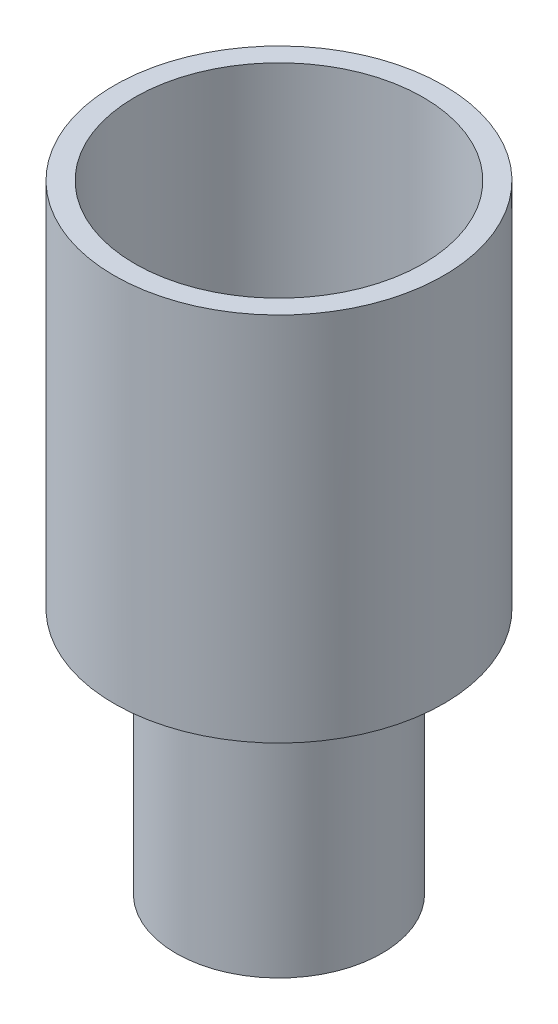
ISO-10303-21;
HEADER;
FILE_DESCRIPTION(('STEP AP214'),'2;1');
FILE_NAME('part.step','',(''),(''),'','','');
FILE_SCHEMA(('AUTOMOTIVE_DESIGN { 1 0 10303 214 1 1 1 1 }'));
ENDSEC;
DATA;
#1=APPLICATION_CONTEXT('core data for automotive mechanical design processes');
#2=APPLICATION_PROTOCOL_DEFINITION('international standard','automotive_design',2000,#1);
#3=PRODUCT_CONTEXT('',#1,'mechanical');
#4=PRODUCT('Part','Part','',(#3));
#5=PRODUCT_RELATED_PRODUCT_CATEGORY('part','',(#4));
#6=PRODUCT_DEFINITION_FORMATION('','',#4);
#7=PRODUCT_DEFINITION_CONTEXT('part definition',#1,'design');
#8=PRODUCT_DEFINITION('design','',#6,#7);
#9=PRODUCT_DEFINITION_SHAPE('','',#8);
#10=(LENGTH_UNIT() NAMED_UNIT(*) SI_UNIT(.MILLI.,.METRE.));
#11=(NAMED_UNIT(*) PLANE_ANGLE_UNIT() SI_UNIT($,.RADIAN.));
#12=(NAMED_UNIT(*) SI_UNIT($,.STERADIAN.) SOLID_ANGLE_UNIT());
#13=UNCERTAINTY_MEASURE_WITH_UNIT(LENGTH_MEASURE(1.E-05),#10,'distance_accuracy_value','');
#14=(GEOMETRIC_REPRESENTATION_CONTEXT(3) GLOBAL_UNCERTAINTY_ASSIGNED_CONTEXT((#13)) GLOBAL_UNIT_ASSIGNED_CONTEXT((#10,
#11,#12)) REPRESENTATION_CONTEXT('',''));
#15=CARTESIAN_POINT('',(0.,0.,0.));
#16=DIRECTION('',(0.,0.,1.));
#17=DIRECTION('',(1.,0.,0.));
#18=AXIS2_PLACEMENT_3D('',#15,#16,#17);
#19=CARTESIAN_POINT('',(0.,5.,0.));
#20=DIRECTION('',(0.,-1.,0.));
#21=DIRECTION('',(0.,0.,-1.));
#22=AXIS2_PLACEMENT_3D('',#19,#20,#21);
#23=CYLINDRICAL_SURFACE('',#22,2.5);
#24=CARTESIAN_POINT('',(0.,5.,0.));
#25=DIRECTION('',(0.,-1.,0.));
#26=DIRECTION('',(0.,0.,-1.));
#27=AXIS2_PLACEMENT_3D('',#24,#25,#26);
#28=CIRCLE('',#27,2.5);
#29=CARTESIAN_POINT('',(0.,5.,-2.5));
#30=VERTEX_POINT('',#29);
#31=EDGE_CURVE('E11',#30,#30,#28,.F.);
#32=ORIENTED_EDGE('',*,*,#31,.F.);
#33=EDGE_LOOP('',(#32));
#34=FACE_BOUND('',#33,.T.);
#35=CARTESIAN_POINT('',(0.,0.,0.));
#36=DIRECTION('',(0.,1.,0.));
#37=DIRECTION('',(0.,0.,1.));
#38=AXIS2_PLACEMENT_3D('',#35,#36,#37);
#39=CIRCLE('',#38,2.5);
#40=CARTESIAN_POINT('',(0.,0.,2.5));
#41=VERTEX_POINT('',#40);
#42=EDGE_CURVE('E52',#41,#41,#39,.T.);
#43=ORIENTED_EDGE('',*,*,#42,.T.);
#44=EDGE_LOOP('',(#43));
#45=FACE_BOUND('',#44,.T.);
#46=ADVANCED_FACE('F45',(#34,#45),#23,.T.);
#47=CARTESIAN_POINT('',(0.,0.,0.));
#48=DIRECTION('',(0.,1.,0.));
#49=DIRECTION('',(0.,0.,1.));
#50=AXIS2_PLACEMENT_3D('',#47,#48,#49);
#51=PLANE('',#50);
#52=CARTESIAN_POINT('',(0.,0.,0.));
#53=DIRECTION('',(0.,1.,0.));
#54=DIRECTION('',(0.,0.,1.));
#55=AXIS2_PLACEMENT_3D('',#52,#53,#54);
#56=CIRCLE('',#55,2.);
#57=CARTESIAN_POINT('',(0.,0.,2.));
#58=VERTEX_POINT('',#57);
#59=EDGE_CURVE('E57',#58,#58,#56,.T.);
#60=ORIENTED_EDGE('',*,*,#59,.T.);
#61=EDGE_LOOP('',(#60));
#62=FACE_BOUND('',#61,.T.);
#63=ORIENTED_EDGE('',*,*,#42,.F.);
#64=EDGE_LOOP('',(#63));
#65=FACE_BOUND('',#64,.T.);
#66=ADVANCED_FACE('F129',(#62,#65),#51,.F.);
#67=CARTESIAN_POINT('',(0.,-5.,0.));
#68=DIRECTION('',(0.,1.,0.));
#69=DIRECTION('',(0.,0.,1.));
#70=AXIS2_PLACEMENT_3D('',#67,#68,#69);
#71=CYLINDRICAL_SURFACE('',#70,2.);
#72=ORIENTED_EDGE('',*,*,#59,.F.);
#73=EDGE_LOOP('',(#72));
#74=FACE_BOUND('',#73,.T.);
#75=CARTESIAN_POINT('',(0.,6.,0.));
#76=DIRECTION('',(0.,-1.,0.));
#77=DIRECTION('',(0.,0.,-1.));
#78=AXIS2_PLACEMENT_3D('',#75,#76,#77);
#79=CIRCLE('',#78,2.);
#80=CARTESIAN_POINT('',(0.,6.,-2.));
#81=VERTEX_POINT('',#80);
#82=EDGE_CURVE('E48',#81,#81,#79,.T.);
#83=ORIENTED_EDGE('',*,*,#82,.F.);
#84=EDGE_LOOP('',(#83));
#85=FACE_BOUND('',#84,.T.);
#86=ADVANCED_FACE('F90',(#74,#85),#71,.F.);
#87=CARTESIAN_POINT('',(0.174217076163708,5.,2.49392229437346));
#88=CARTESIAN_POINT('',(2.21705391494678,6.,3.32936509536265));
#89=CARTESIAN_POINT('',(5.16206166491062,5.,2.14548814204604));
#90=CARTESIAN_POINT('',(8.87578410567208,6.,-1.10474273453091));
#91=CARTESIAN_POINT('',(4.81362751258321,5.,-2.84235644670087));
#92=CARTESIAN_POINT('',(4.44167627577852,6.,-7.76347292525621));
#93=CARTESIAN_POINT('',(-0.174217076163708,5.,-2.49392229437346));
#94=CARTESIAN_POINT('',(-2.21705391494678,6.,-3.32936509536265));
#95=CARTESIAN_POINT('',(-5.16206166491062,5.,-2.14548814204604));
#96=CARTESIAN_POINT('',(-8.87578410567208,6.,1.1047427345309));
#97=CARTESIAN_POINT('',(-4.81362751258321,5.,2.84235644670088));
#98=CARTESIAN_POINT('',(-4.44167627577852,6.,7.7634729252562));
#99=CARTESIAN_POINT('',(0.174217076163708,5.,2.49392229437346));
#100=CARTESIAN_POINT('',(2.21705391494678,6.,3.32936509536265));
#101=(BOUNDED_SURFACE() B_SPLINE_SURFACE(3,1,((#87,#88),(#89,#90),(#91,#92),(#93,#94),(#95,#96),
(#97,#98),(#99,#100)),.UNSPECIFIED.,.T.,.F.,.F.) B_SPLINE_SURFACE_WITH_KNOTS((4,3,4),(2,2),(0.,
0.5,1.),(0.,1.),.UNSPECIFIED.) GEOMETRIC_REPRESENTATION_ITEM() RATIONAL_B_SPLINE_SURFACE(((1.,
1.),(0.333333333333333,0.333333333333333),(0.333333333333333,0.333333333333333),(1.,1.),
(0.333333333333333,0.333333333333334),(0.333333333333333,0.333333333333334),(1.,1.))) REPRESENTATION_ITEM('') SURFACE());
#102=CARTESIAN_POINT('',(-1.36727064176107E-12,6.0000000000011,-4.00000000000202));
#103=CARTESIAN_POINT('',(0.0656009754900479,6.0000000000011,-4.00000143440903));
#104=CARTESIAN_POINT('',(0.131202001130645,6.0000000000011,-3.99838626246379));
#105=CARTESIAN_POINT('',(0.263911971328443,6.0000000000011,-3.99185075355102));
#106=CARTESIAN_POINT('',(0.331016837137034,6.0000000000011,-3.98684740733562));
#107=CARTESIAN_POINT('',(0.466524932259604,6.0000000000011,-3.97329893992633));
#108=CARTESIAN_POINT('',(0.534919815567753,6.0000000000011,-3.96467025403791));
#109=CARTESIAN_POINT('',(0.672763982099416,6.0000000000011,-3.94364830448712));
#110=CARTESIAN_POINT('',(0.742200582547428,6.0000000000011,-3.93117182272015));
#111=CARTESIAN_POINT('',(0.881849459970136,6.0000000000011,-3.90224785895984));
#112=CARTESIAN_POINT('',(0.952044770703426,6.0000000000011,-3.8857184213441));
#113=CARTESIAN_POINT('',(1.092898327466,6.0000000000011,-3.84850487502272));
#114=CARTESIAN_POINT('',(1.16353552586295,6.0000000000011,-3.82774106853273));
#115=CARTESIAN_POINT('',(1.30492759368419,6.0000000000011,-3.78190359496053));
#116=CARTESIAN_POINT('',(1.3756576966837,6.0000000000011,-3.75675351464487));
#117=CARTESIAN_POINT('',(1.51686115676029,6.0000000000011,-3.70202229163667));
#118=CARTESIAN_POINT('',(1.58730657833087,6.0000000000011,-3.67236904071614));
#119=CARTESIAN_POINT('',(1.72753869197221,6.0000000000011,-3.60855139986938));
#120=CARTESIAN_POINT('',(1.79729496752684,6.0000000000011,-3.5743202143824));
#121=CARTESIAN_POINT('',(1.93573324851001,6.0000000000011,-3.50130708398049));
#122=CARTESIAN_POINT('',(2.00438336208988,6.0000000000011,-3.46246448782055));
#123=CARTESIAN_POINT('',(2.10588262949004,6.0000000000011,-3.40100647404193));
#124=CARTESIAN_POINT('',(2.1396374222768,6.0000000000011,-3.37987244537724));
#125=CARTESIAN_POINT('',(2.2067104092738,6.0000000000011,-3.33647035297228));
#126=CARTESIAN_POINT('',(2.2400245717925,6.0000000000011,-3.31419604288097));
#127=CARTESIAN_POINT('',(2.30615934433747,6.0000000000011,-3.26852466029188));
#128=CARTESIAN_POINT('',(2.33897597484391,6.0000000000011,-3.24512182878703));
#129=CARTESIAN_POINT('',(2.4040607673726,6.0000000000011,-3.19720713736916));
#130=CARTESIAN_POINT('',(2.4363250540153,6.0000000000011,-3.17269001230381));
#131=CARTESIAN_POINT('',(2.50025006797776,6.0000000000011,-3.12256424026835));
#132=CARTESIAN_POINT('',(2.53190706215156,6.0000000000011,-3.09695083253483));
#133=CARTESIAN_POINT('',(2.59456316911076,6.0000000000011,-3.04465343677009));
#134=CARTESIAN_POINT('',(2.62555873334223,6.0000000000011,-3.01796519716434));
#135=CARTESIAN_POINT('',(2.68683852266178,6.0000000000011,-2.96354259109181));
#136=CARTESIAN_POINT('',(2.71711942535202,6.0000000000011,-2.93580448354372));
#137=CARTESIAN_POINT('',(2.77691762491078,6.0000000000011,-2.87931003907636));
#138=CARTESIAN_POINT('',(2.80643186700953,6.0000000000011,-2.85055046868548));
#139=CARTESIAN_POINT('',(2.86464593263685,6.0000000000011,-2.79204437819917));
#140=CARTESIAN_POINT('',(2.89334300966448,6.0000000000011,-2.76229512526933));
#141=CARTESIAN_POINT('',(2.94987366134269,6.0000000000011,-2.70184423486072));
#142=CARTESIAN_POINT('',(2.97770483717647,6.0000000000011,-2.67114035409845));
#143=CARTESIAN_POINT('',(3.03245659458764,6.0000000000011,-2.60881793850382));
#144=CARTESIAN_POINT('',(3.05937516274723,6.0000000000011,-2.57719763481575));
#145=CARTESIAN_POINT('',(3.11225685870659,6.0000000000011,-2.51308312327764));
#146=CARTESIAN_POINT('',(3.13821839405879,6.0000000000011,-2.4805876019646));
#147=CARTESIAN_POINT('',(3.18914366446465,6.0000000000011,-2.41476625476008));
#148=CARTESIAN_POINT('',(3.21410626104089,6.0000000000011,-2.38143954803558));
#149=CARTESIAN_POINT('',(3.262994004824,6.0000000000011,-2.31400208685533));
#150=CARTESIAN_POINT('',(3.28691849755374,6.0000000000011,-2.27989085794491));
#151=CARTESIAN_POINT('',(3.33369330188344,6.0000000000011,-2.2109330532376));
#152=CARTESIAN_POINT('',(3.35654346970404,6.0000000000011,-2.1760863799136));
#153=CARTESIAN_POINT('',(3.4011359957403,6.0000000000011,-2.10570859913371));
#154=CARTESIAN_POINT('',(3.42287874391906,6.0000000000011,-2.07017773876439));
#155=CARTESIAN_POINT('',(3.46522606901092,6.0000000000011,-1.99848445996687));
#156=CARTESIAN_POINT('',(3.48583158875003,6.0000000000011,-1.96232259843829));
#157=CARTESIAN_POINT('',(3.52587750153337,6.0000000000011,-1.88942189417207));
#158=CARTESIAN_POINT('',(3.54531940524508,6.0000000000011,-1.8526838812695));
#159=CARTESIAN_POINT('',(3.58301465074773,6.0000000000011,-1.7786868780863));
#160=CARTESIAN_POINT('',(3.60127008172412,6.0000000000011,-1.74142895205744));
#161=CARTESIAN_POINT('',(3.63657255426536,6.0000000000011,-1.66644927137695));
#162=CARTESIAN_POINT('',(3.65362226980814,6.0000000000011,-1.62872877568732));
#163=CARTESIAN_POINT('',(3.68649715224871,6.0000000000011,-1.55288196152527));
#164=CARTESIAN_POINT('',(3.70232557975062,6.0000000000011,-1.51475705629484));
#165=CARTESIAN_POINT('',(3.73274542823425,6.0000000000011,-1.43815999709401));
#166=CARTESIAN_POINT('',(3.747340693862,6.0000000000011,-1.39968936995189));
#167=CARTESIAN_POINT('',(3.77528546851964,6.0000000000011,-1.32245971568389));
#168=CARTESIAN_POINT('',(3.78863939931568,6.0000000000011,-1.28370228848953));
#169=CARTESIAN_POINT('',(3.81409643995404,6.0000000000011,-1.20595788663016));
#170=CARTESIAN_POINT('',(3.82620453756943,6.0000000000011,-1.16697254509729));
#171=CARTESIAN_POINT('',(3.84916849214699,6.0000000000011,-1.08883083520675));
#172=CARTESIAN_POINT('',(3.86002988774767,6.0000000000011,-1.04967609457952));
#173=CARTESIAN_POINT('',(3.88050257211134,6.0000000000011,-0.971253711265688));
#174=CARTESIAN_POINT('',(3.890119931568,6.0000000000011,-0.931987652763613));
#175=CARTESIAN_POINT('',(3.90811021065753,6.0000000000011,-0.853399336105698));
#176=CARTESIAN_POINT('',(3.91648971035952,6.0000000000011,-0.814078586262371));
#177=CARTESIAN_POINT('',(3.93201307994841,6.0000000000011,-0.735438759294172));
#178=CARTESIAN_POINT('',(3.93916401499333,6.0000000000011,-0.696121068301658));
#179=CARTESIAN_POINT('',(3.95871589098081,6.0000000000011,-0.578643929229074));
#180=CARTESIAN_POINT('',(3.96939189315774,6.0000000000011,-0.50018980387844));
#181=CARTESIAN_POINT('',(3.98595065572778,6.0000000000011,-0.343922859284506));
#182=CARTESIAN_POINT('',(3.99190007684962,6.0000000000011,-0.266117020117891));
#183=CARTESIAN_POINT('',(3.99918141456733,6.0000000000011,-0.11153117296645));
#184=CARTESIAN_POINT('',(4.0005854056832,6.0000000000011,-0.0347545768853575));
#185=CARTESIAN_POINT('',(3.99898765788649,6.0000000000011,0.117414013354459));
#186=CARTESIAN_POINT('',(3.99606226429354,6.0000000000011,0.192806821951724));
#187=CARTESIAN_POINT('',(3.98604912380406,6.0000000000011,0.341889172273821));
#188=CARTESIAN_POINT('',(3.97904079539286,6.0000000000011,0.415584053473362));
#189=CARTESIAN_POINT('',(3.96112940684747,6.0000000000011,0.560991279526934));
#190=CARTESIAN_POINT('',(3.95030767249542,6.0000000000011,0.632713650377753));
#191=CARTESIAN_POINT('',(3.92505482682694,6.0000000000011,0.773937659290823));
#192=CARTESIAN_POINT('',(3.91070583893747,6.0000000000011,0.843453990287012));
#193=CARTESIAN_POINT('',(3.8786951982433,6.0000000000011,0.980068434977841));
#194=CARTESIAN_POINT('',(3.86111544572916,6.0000000000011,1.04718574773122));
#195=CARTESIAN_POINT('',(3.82294551119973,6.0000000000011,1.17884432486595));
#196=CARTESIAN_POINT('',(3.80243609457786,6.0000000000011,1.24340901339922));
#197=CARTESIAN_POINT('',(3.75870935446792,6.0000000000011,1.36984226833448));
#198=CARTESIAN_POINT('',(3.73557087231651,6.0000000000011,1.43173811108932));
#199=CARTESIAN_POINT('',(3.68688426246551,6.0000000000011,1.55274887901178));
#200=CARTESIAN_POINT('',(3.66141239160759,6.0000000000011,1.6118944941424));
#201=CARTESIAN_POINT('',(3.60834917218522,6.0000000000011,1.72735237565971));
#202=CARTESIAN_POINT('',(3.58083096435886,6.00000000000111,1.78369826613098));
#203=CARTESIAN_POINT('',(3.52395402936124,6.00000000000111,1.89353344375242));
#204=CARTESIAN_POINT('',(3.4946649192017,6.0000000000011,1.94705879065126));
#205=CARTESIAN_POINT('',(3.43451149960372,6.0000000000011,2.05125547807341));
#206=CARTESIAN_POINT('',(3.40371299126969,6.0000000000011,2.10196481525173));
#207=CARTESIAN_POINT('',(3.34079066654617,6.0000000000011,2.20055458647921));
#208=CARTESIAN_POINT('',(3.30872864752494,6.0000000000011,2.24847447017407));
#209=CARTESIAN_POINT('',(3.24351254882722,6.0000000000011,2.34152967333799));
#210=CARTESIAN_POINT('',(3.21041616671217,6.0000000000011,2.38670543803266));
#211=CARTESIAN_POINT('',(3.14334723545589,6.0000000000011,2.47433285506001));
#212=CARTESIAN_POINT('',(3.10942826653459,6.0000000000011,2.51682552569758));
#213=CARTESIAN_POINT('',(3.04091242306153,6.0000000000011,2.5991603980909));
#214=CARTESIAN_POINT('',(3.00636505923824,6.0000000000011,2.63904380913906));
#215=CARTESIAN_POINT('',(2.93677313545699,6.0000000000011,2.71624431314611));
#216=CARTESIAN_POINT('',(2.90177411741347,6.0000000000011,2.75360246771399));
#217=CARTESIAN_POINT('',(2.83144241276376,6.0000000000011,2.82584469025143));
#218=CARTESIAN_POINT('',(2.79615144116582,6.0000000000011,2.86076937786247));
#219=CARTESIAN_POINT('',(2.72538277149423,6.0000000000011,2.9282428177219));
#220=CARTESIAN_POINT('',(2.68994313423801,6.0000000000011,2.96083149710848));
#221=CARTESIAN_POINT('',(2.61900825488167,6.0000000000011,3.0237350953184));
#222=CARTESIAN_POINT('',(2.58354761383709,6.0000000000011,3.05408904011851));
#223=CARTESIAN_POINT('',(2.5126869161811,6.0000000000011,3.11262772443188));
#224=CARTESIAN_POINT('',(2.47731820911187,6.0000000000011,3.14085041933333));
#225=CARTESIAN_POINT('',(2.40674359122443,6.0000000000011,3.19523214467838));
#226=CARTESIAN_POINT('',(2.37156599431832,6.0000000000011,3.22142792623851));
#227=CARTESIAN_POINT('',(2.30146286806146,6.0000000000011,3.27186115314793));
#228=CARTESIAN_POINT('',(2.2665628339881,6.0000000000011,3.29613404462985));
#229=CARTESIAN_POINT('',(2.1962866933888,6.0000000000011,3.34336700662876));
#230=CARTESIAN_POINT('',(2.16091655875907,6.0000000000011,3.36633596318061));
#231=CARTESIAN_POINT('',(2.08835542183455,6.0000000000011,3.41184147309539));
#232=CARTESIAN_POINT('',(2.0511420125162,6.0000000000011,3.43434230605359));
#233=CARTESIAN_POINT('',(1.97481103352454,6.0000000000011,3.47881210914086));
#234=CARTESIAN_POINT('',(1.93567048792475,6.0000000000011,3.50074164897236));
#235=CARTESIAN_POINT('',(1.85542579031111,6.0000000000011,3.54394365397896));
#236=CARTESIAN_POINT('',(1.8142986702235,6.0000000000011,3.56517346682573));
#237=CARTESIAN_POINT('',(1.73002686542774,6.0000000000011,3.60683870675422));
#238=CARTESIAN_POINT('',(1.68685941924268,6.0000000000011,3.62722810713776));
#239=CARTESIAN_POINT('',(1.59846002555323,6.0000000000011,3.66706269990451));
#240=CARTESIAN_POINT('',(1.55320575135433,6.0000000000011,3.68645835812834));
#241=CARTESIAN_POINT('',(1.46059453351595,6.0000000000011,3.72414284448265));
#242=CARTESIAN_POINT('',(1.4132159570603,6.0000000000011,3.74237852362617));
#243=CARTESIAN_POINT('',(1.31632866687928,6.0000000000011,3.77756752619032));
#244=CARTESIAN_POINT('',(1.26679930380896,6.0000000000011,3.79446401228465));
#245=CARTESIAN_POINT('',(1.16559579146201,6.0000000000011,3.82678632118646));
#246=CARTESIAN_POINT('',(1.11390229503866,6.0000000000011,3.84215158752884));
#247=CARTESIAN_POINT('',(1.00837097461533,6.0000000000011,3.8712107664529));
#248=CARTESIAN_POINT('',(0.954515450563424,6.0000000000011,3.88484042503518));
#249=CARTESIAN_POINT('',(0.844678075538326,6.0000000000011,3.91021604487809));
#250=CARTESIAN_POINT('',(0.788680537876825,6.0000000000011,3.92189413884261));
#251=CARTESIAN_POINT('',(0.674597220996415,6.0000000000011,3.94314374906572));
#252=CARTESIAN_POINT('',(0.616498149118075,6.0000000000011,3.95264394204619));
#253=CARTESIAN_POINT('',(0.498272533116603,6.0000000000011,3.96930589060073));
#254=CARTESIAN_POINT('',(0.438135475993058,6.0000000000011,3.97639310749066));
#255=CARTESIAN_POINT('',(0.315919930903521,6.0000000000011,3.98799031466373));
#256=CARTESIAN_POINT('',(0.253834088089879,6.0000000000011,3.9924228840134));
#257=CARTESIAN_POINT('',(0.127834777511987,6.0000000000011,3.99846766287517));
#258=CARTESIAN_POINT('',(0.0639174695443891,6.0000000000011,4.00000000265126));
#259=CARTESIAN_POINT('',(-0.0656009060451658,6.0000000000011,3.999999997283));
#260=CARTESIAN_POINT('',(-0.13120198229024,6.0000000000011,3.99838587257131));
#261=CARTESIAN_POINT('',(-0.263911990647982,6.0000000000011,3.99185115335888));
#262=CARTESIAN_POINT('',(-0.331016842375908,6.0000000000011,3.98684751575137));
#263=CARTESIAN_POINT('',(-0.466524926892708,6.0000000000011,3.97329882886115));
#264=CARTESIAN_POINT('',(-0.534919814113178,6.0000000000011,3.96467022393619));
#265=CARTESIAN_POINT('',(-0.672763983587968,6.0000000000011,3.94364833529189));
#266=CARTESIAN_POINT('',(-0.74220058295064,6.0000000000011,3.93117183106434));
#267=CARTESIAN_POINT('',(-0.881849459557986,6.0000000000011,3.90224785043053));
#268=CARTESIAN_POINT('',(-0.952044770591856,6.0000000000011,3.88571841903515));
#269=CARTESIAN_POINT('',(-1.09289832757991,6.0000000000011,3.84850487737998));
#270=CARTESIAN_POINT('',(-1.16353552589377,6.0000000000011,3.82774106917043));
#271=CARTESIAN_POINT('',(-1.30492759365277,6.0000000000011,3.78190359431034));
#272=CARTESIAN_POINT('',(-1.37565769667521,6.0000000000011,3.75675351446912));
#273=CARTESIAN_POINT('',(-1.51686115676894,6.0000000000011,3.70202229181561));
#274=CARTESIAN_POINT('',(-1.5873065783332,6.0000000000011,3.6723690407644));
#275=CARTESIAN_POINT('',(-1.72753869196984,6.0000000000011,3.60855139982031));
#276=CARTESIAN_POINT('',(-1.79729496752622,6.0000000000011,3.57432021436945));
#277=CARTESIAN_POINT('',(-1.93573324851065,6.0000000000011,3.50130708399363));
#278=CARTESIAN_POINT('',(-2.00438336209,6.0000000000011,3.46246448782297));
#279=CARTESIAN_POINT('',(-2.10588262948998,6.0000000000011,3.4010064740407));
#280=CARTESIAN_POINT('',(-2.13963742227678,6.0000000000011,3.37987244537691));
#281=CARTESIAN_POINT('',(-2.20671040927382,6.0000000000011,3.33647035297261));
#282=CARTESIAN_POINT('',(-2.2400245717925,6.0000000000011,3.31419604288105));
#283=CARTESIAN_POINT('',(-2.30615934433747,6.0000000000011,3.26852466029178));
#284=CARTESIAN_POINT('',(-2.33897597484391,6.0000000000011,3.24512182878701));
#285=CARTESIAN_POINT('',(-2.4040607673726,6.0000000000011,3.19720713736918));
#286=CARTESIAN_POINT('',(-2.4363250540153,6.0000000000011,3.17269001230381));
#287=CARTESIAN_POINT('',(-2.50025006797776,6.0000000000011,3.12256424026834));
#288=CARTESIAN_POINT('',(-2.53190706215156,6.0000000000011,3.09695083253483));
#289=CARTESIAN_POINT('',(-2.59456316911076,6.0000000000011,3.04465343677009));
#290=CARTESIAN_POINT('',(-2.62555873334223,6.0000000000011,3.01796519716433));
#291=CARTESIAN_POINT('',(-2.68683852266178,6.0000000000011,2.9635425910918));
#292=CARTESIAN_POINT('',(-2.71711942535202,6.0000000000011,2.93580448354372));
#293=CARTESIAN_POINT('',(-2.77691762491078,6.0000000000011,2.87931003907636));
#294=CARTESIAN_POINT('',(-2.80643186700953,6.0000000000011,2.85055046868548));
#295=CARTESIAN_POINT('',(-2.86464593263685,6.0000000000011,2.79204437819917));
#296=CARTESIAN_POINT('',(-2.89334300966448,6.0000000000011,2.76229512526933));
#297=CARTESIAN_POINT('',(-2.94987366134269,6.0000000000011,2.70184423486071));
#298=CARTESIAN_POINT('',(-2.97770483717647,6.0000000000011,2.67114035409845));
#299=CARTESIAN_POINT('',(-3.03245659458764,6.0000000000011,2.60881793850381));
#300=CARTESIAN_POINT('',(-3.05937516274723,6.0000000000011,2.57719763481574));
#301=CARTESIAN_POINT('',(-3.11225685870659,6.0000000000011,2.51308312327764));
#302=CARTESIAN_POINT('',(-3.1382183940588,6.0000000000011,2.4805876019646));
#303=CARTESIAN_POINT('',(-3.18914366446465,6.0000000000011,2.41476625476008));
#304=CARTESIAN_POINT('',(-3.21410626104089,6.0000000000011,2.38143954803557));
#305=CARTESIAN_POINT('',(-3.262994004824,6.0000000000011,2.31400208685533));
#306=CARTESIAN_POINT('',(-3.28691849755374,6.0000000000011,2.27989085794491));
#307=CARTESIAN_POINT('',(-3.33369330188344,6.0000000000011,2.2109330532376));
#308=CARTESIAN_POINT('',(-3.35654346970404,6.0000000000011,2.17608637991359));
#309=CARTESIAN_POINT('',(-3.4011359957403,6.0000000000011,2.1057085991337));
#310=CARTESIAN_POINT('',(-3.42287874391906,6.0000000000011,2.07017773876439));
#311=CARTESIAN_POINT('',(-3.46522606901092,6.0000000000011,1.99848445996687));
#312=CARTESIAN_POINT('',(-3.48583158875003,6.0000000000011,1.96232259843829));
#313=CARTESIAN_POINT('',(-3.52587750153338,6.0000000000011,1.88942189417207));
#314=CARTESIAN_POINT('',(-3.54531940524508,6.0000000000011,1.8526838812695));
#315=CARTESIAN_POINT('',(-3.58301465074773,6.0000000000011,1.77868687808629));
#316=CARTESIAN_POINT('',(-3.60127008172412,6.0000000000011,1.74142895205743));
#317=CARTESIAN_POINT('',(-3.63657255426536,6.0000000000011,1.66644927137695));
#318=CARTESIAN_POINT('',(-3.65362226980814,6.0000000000011,1.62872877568731));
#319=CARTESIAN_POINT('',(-3.68649715224871,6.0000000000011,1.55288196152527));
#320=CARTESIAN_POINT('',(-3.70232557975062,6.0000000000011,1.51475705629484));
#321=CARTESIAN_POINT('',(-3.73274542823425,6.0000000000011,1.43815999709401));
#322=CARTESIAN_POINT('',(-3.74734069386201,6.0000000000011,1.39968936995189));
#323=CARTESIAN_POINT('',(-3.77528546851964,6.0000000000011,1.32245971568389));
#324=CARTESIAN_POINT('',(-3.78863939931568,6.0000000000011,1.28370228848953));
#325=CARTESIAN_POINT('',(-3.81409643995404,6.0000000000011,1.20595788663016));
#326=CARTESIAN_POINT('',(-3.82620453756943,6.0000000000011,1.16697254509729));
#327=CARTESIAN_POINT('',(-3.84916849214699,6.0000000000011,1.08883083520675));
#328=CARTESIAN_POINT('',(-3.86002988774767,6.0000000000011,1.04967609457951));
#329=CARTESIAN_POINT('',(-3.88050257211134,6.0000000000011,0.971253711265686));
#330=CARTESIAN_POINT('',(-3.890119931568,6.0000000000011,0.931987652763611));
#331=CARTESIAN_POINT('',(-3.90811021065753,6.0000000000011,0.853399336105696));
#332=CARTESIAN_POINT('',(-3.91648971035952,6.0000000000011,0.814078586262369));
#333=CARTESIAN_POINT('',(-3.93201307994841,6.0000000000011,0.735438759294171));
#334=CARTESIAN_POINT('',(-3.93916401499333,6.0000000000011,0.696121068301657));
#335=CARTESIAN_POINT('',(-3.95871589098081,6.0000000000011,0.578643929229074));
#336=CARTESIAN_POINT('',(-3.96939189315774,6.0000000000011,0.500189803878443));
#337=CARTESIAN_POINT('',(-3.98595065572778,6.0000000000011,0.34392285928451));
#338=CARTESIAN_POINT('',(-3.99190007684962,6.0000000000011,0.266117020117892));
#339=CARTESIAN_POINT('',(-3.99918141456733,6.0000000000011,0.111531172966449));
#340=CARTESIAN_POINT('',(-4.0005854056832,6.00000000000111,0.0347545768853566));
#341=CARTESIAN_POINT('',(-3.99898765788649,6.0000000000011,-0.11741401335446));
#342=CARTESIAN_POINT('',(-3.99606226429354,6.0000000000011,-0.192806821951725));
#343=CARTESIAN_POINT('',(-3.98604912380406,6.0000000000011,-0.341889172273822));
#344=CARTESIAN_POINT('',(-3.97904079539286,6.0000000000011,-0.415584053473363));
#345=CARTESIAN_POINT('',(-3.96112940684747,6.0000000000011,-0.560991279526935));
#346=CARTESIAN_POINT('',(-3.95030767249543,6.0000000000011,-0.632713650377754));
#347=CARTESIAN_POINT('',(-3.92505482682694,6.0000000000011,-0.773937659290823));
#348=CARTESIAN_POINT('',(-3.91070583893747,6.0000000000011,-0.843453990287012));
#349=CARTESIAN_POINT('',(-3.8786951982433,6.0000000000011,-0.980068434977841));
#350=CARTESIAN_POINT('',(-3.86111544572916,6.0000000000011,-1.04718574773122));
#351=CARTESIAN_POINT('',(-3.82294551119973,6.0000000000011,-1.17884432486595));
#352=CARTESIAN_POINT('',(-3.80243609457786,6.0000000000011,-1.24340901339922));
#353=CARTESIAN_POINT('',(-3.75870935446792,6.0000000000011,-1.36984226833448));
#354=CARTESIAN_POINT('',(-3.73557087231651,6.0000000000011,-1.43173811108932));
#355=CARTESIAN_POINT('',(-3.68688426246551,6.0000000000011,-1.55274887901178));
#356=CARTESIAN_POINT('',(-3.66141239160759,6.0000000000011,-1.6118944941424));
#357=CARTESIAN_POINT('',(-3.60834917218522,6.0000000000011,-1.72735237565971));
#358=CARTESIAN_POINT('',(-3.58083096435885,6.0000000000011,-1.78369826613098));
#359=CARTESIAN_POINT('',(-3.52395402936124,6.0000000000011,-1.89353344375242));
#360=CARTESIAN_POINT('',(-3.4946649192017,6.0000000000011,-1.94705879065126));
#361=CARTESIAN_POINT('',(-3.43451149960373,6.0000000000011,-2.05125547807341));
#362=CARTESIAN_POINT('',(-3.40371299126969,6.0000000000011,-2.10196481525173));
#363=CARTESIAN_POINT('',(-3.34079066654617,6.0000000000011,-2.20055458647921));
#364=CARTESIAN_POINT('',(-3.30872864752494,6.0000000000011,-2.24847447017407));
#365=CARTESIAN_POINT('',(-3.24351254882722,6.0000000000011,-2.34152967333799));
#366=CARTESIAN_POINT('',(-3.21041616671217,6.0000000000011,-2.38670543803266));
#367=CARTESIAN_POINT('',(-3.14334723545589,6.0000000000011,-2.47433285506001));
#368=CARTESIAN_POINT('',(-3.1094282665346,6.0000000000011,-2.51682552569758));
#369=CARTESIAN_POINT('',(-3.04091242306153,6.0000000000011,-2.5991603980909));
#370=CARTESIAN_POINT('',(-3.00636505923824,6.0000000000011,-2.63904380913906));
#371=CARTESIAN_POINT('',(-2.93677313545699,6.0000000000011,-2.71624431314611));
#372=CARTESIAN_POINT('',(-2.90177411741347,6.0000000000011,-2.75360246771399));
#373=CARTESIAN_POINT('',(-2.83144241276376,6.0000000000011,-2.82584469025143));
#374=CARTESIAN_POINT('',(-2.79615144116582,6.0000000000011,-2.86076937786248));
#375=CARTESIAN_POINT('',(-2.72538277149423,6.0000000000011,-2.9282428177219));
#376=CARTESIAN_POINT('',(-2.68994313423801,6.0000000000011,-2.96083149710848));
#377=CARTESIAN_POINT('',(-2.61900825488167,6.0000000000011,-3.0237350953184));
#378=CARTESIAN_POINT('',(-2.58354761383709,6.0000000000011,-3.05408904011851));
#379=CARTESIAN_POINT('',(-2.5126869161811,6.0000000000011,-3.11262772443188));
#380=CARTESIAN_POINT('',(-2.47731820911187,6.0000000000011,-3.14085041933333));
#381=CARTESIAN_POINT('',(-2.40674359122443,6.0000000000011,-3.19523214467838));
#382=CARTESIAN_POINT('',(-2.37156599431832,6.0000000000011,-3.22142792623851));
#383=CARTESIAN_POINT('',(-2.30146286806146,6.0000000000011,-3.27186115314793));
#384=CARTESIAN_POINT('',(-2.2665628339881,6.0000000000011,-3.29613404462985));
#385=CARTESIAN_POINT('',(-2.1962866933888,6.0000000000011,-3.34336700662876));
#386=CARTESIAN_POINT('',(-2.16091655875906,6.0000000000011,-3.36633596318062));
#387=CARTESIAN_POINT('',(-2.08835542183455,6.0000000000011,-3.41184147309538));
#388=CARTESIAN_POINT('',(-2.05114201251619,6.0000000000011,-3.43434230605357));
#389=CARTESIAN_POINT('',(-1.97481103352454,6.0000000000011,-3.47881210914088));
#390=CARTESIAN_POINT('',(-1.93567048792475,6.0000000000011,-3.50074164897246));
#391=CARTESIAN_POINT('',(-1.8554257903111,6.0000000000011,-3.54394365397886));
#392=CARTESIAN_POINT('',(-1.81429867022348,6.0000000000011,-3.56517346682534));
#393=CARTESIAN_POINT('',(-1.73002686542776,6.0000000000011,-3.60683870675462));
#394=CARTESIAN_POINT('',(-1.68685941924276,6.0000000000011,-3.62722810713927));
#395=CARTESIAN_POINT('',(-1.59846002555315,6.0000000000011,-3.66706269990295));
#396=CARTESIAN_POINT('',(-1.55320575135405,6.0000000000011,-3.68645835812243));
#397=CARTESIAN_POINT('',(-1.46059453351625,6.0000000000011,-3.72414284448874));
#398=CARTESIAN_POINT('',(-1.41321595706143,6.0000000000011,-3.74237852364926));
#399=CARTESIAN_POINT('',(-1.31632866687812,6.0000000000011,-3.77756752616651));
#400=CARTESIAN_POINT('',(-1.26679930380456,6.0000000000011,-3.79446401219444));
#401=CARTESIAN_POINT('',(-1.16559579146655,6.0000000000011,-3.82678632127943));
#402=CARTESIAN_POINT('',(-1.11390229505586,6.0000000000011,-3.84215158788108));
#403=CARTESIAN_POINT('',(-1.00837097459761,6.0000000000011,-3.87121076609006));
#404=CARTESIAN_POINT('',(-0.954515450496305,6.0000000000011,-3.8848404236606));
#405=CARTESIAN_POINT('',(-0.844678075607437,6.0000000000011,-3.91021604629345));
#406=CARTESIAN_POINT('',(-0.788680538138586,6.0000000000011,-3.92189414420334));
#407=CARTESIAN_POINT('',(-0.674597220727025,6.0000000000011,-3.94314374354875));
#408=CARTESIAN_POINT('',(-0.616498148098009,6.0000000000011,-3.95264392115575));
#409=CARTESIAN_POINT('',(-0.498272534165803,6.0000000000011,-3.96930591208783));
#410=CARTESIAN_POINT('',(-0.438135479964793,6.0000000000011,-3.97639318882985));
#411=CARTESIAN_POINT('',(-0.315919926820976,6.0000000000011,-3.9879902310552));
#412=CARTESIAN_POINT('',(-0.253834072640454,6.0000000000011,-3.99242256761674));
#413=CARTESIAN_POINT('',(-0.127834793381014,6.0000000000011,-3.99846798786505));
#414=CARTESIAN_POINT('',(-0.0639175295751729,6.0000000000011,-4.00000123205228));
#415=CARTESIAN_POINT('',(-1.36583827629685E-12,6.0000000000011,-4.00000000000202));
#416=B_SPLINE_CURVE_WITH_KNOTS('',3,(#102,#103,#104,#105,#106,#107,#108,#109,#110,#111,#112,
#113,#114,#115,#116,#117,#118,#119,#120,#121,#122,#123,#124,#125,#126,#127,#128,#129,#130,#131,
#132,#133,#134,#135,#136,#137,#138,#139,#140,#141,#142,#143,#144,#145,#146,#147,#148,#149,#150,
#151,#152,#153,#154,#155,#156,#157,#158,#159,#160,#161,#162,#163,#164,#165,#166,#167,#168,#169,
#170,#171,#172,#173,#174,#175,#176,#177,#178,#179,#180,#181,#182,#183,#184,#185,#186,#187,#188,
#189,#190,#191,#192,#193,#194,#195,#196,#197,#198,#199,#200,#201,#202,#203,#204,#205,#206,#207,
#208,#209,#210,#211,#212,#213,#214,#215,#216,#217,#218,#219,#220,#221,#222,#223,#224,#225,#226,
#227,#228,#229,#230,#231,#232,#233,#234,#235,#236,#237,#238,#239,#240,#241,#242,#243,#244,#245,
#246,#247,#248,#249,#250,#251,#252,#253,#254,#255,#256,#257,#258,#259,#260,#261,#262,#263,#264,
#265,#266,#267,#268,#269,#270,#271,#272,#273,#274,#275,#276,#277,#278,#279,#280,#281,#282,#283,
#284,#285,#286,#287,#288,#289,#290,#291,#292,#293,#294,#295,#296,#297,#298,#299,#300,#301,#302,
#303,#304,#305,#306,#307,#308,#309,#310,#311,#312,#313,#314,#315,#316,#317,#318,#319,#320,#321,
#322,#323,#324,#325,#326,#327,#328,#329,#330,#331,#332,#333,#334,#335,#336,#337,#338,#339,#340,
#341,#342,#343,#344,#345,#346,#347,#348,#349,#350,#351,#352,#353,#354,#355,#356,#357,#358,#359,
#360,#361,#362,#363,#364,#365,#366,#367,#368,#369,#370,#371,#372,#373,#374,#375,#376,#377,#378,
#379,#380,#381,#382,#383,#384,#385,#386,#387,#388,#389,#390,#391,#392,#393,#394,#395,#396,#397,
#398,#399,#400,#401,#402,#403,#404,#405,#406,#407,#408,#409,#410,#411,#412,#413,#414,#415),
.UNSPECIFIED.,.F.,.F.,(4,2,2,2,2,2,2,2,2,2,2,2,2,2,2,2,2,2,2,2,2,2,2,2,2,2,2,2,2,2,2,2,2,2,2,2,
2,2,2,2,2,2,2,2,2,2,2,2,2,2,2,2,2,2,2,2,2,2,2,2,2,2,2,2,2,2,2,2,2,2,2,2,2,2,2,2,2,2,2,2,2,2,2,2,
2,2,2,2,2,2,2,2,2,2,2,2,2,2,2,2,2,2,2,2,2,2,2,2,2,2,2,2,2,2,2,2,2,2,2,2,2,2,2,2,2,2,2,2,2,2,2,2,
2,2,2,2,2,2,2,2,2,2,2,2,2,2,2,2,2,2,2,2,2,2,2,2,4),(0.,0.196783383053342,0.398571175656562,
0.605290189502603,0.816837307907665,1.033077573452,1.25384259155886,1.47892933746293,
1.70809945323987,1.94107911623431,2.17755954977296,2.29702010636767,2.41722511976406,
2.53812680676691,2.659675556886,2.78182003328407,2.90450728472167,3.02768286803299,
3.151290980544,3.27527460172461,3.3995756432524,3.52413510655949,3.64889324683738,
3.77378974239031,3.89876386815648,4.02375467216055,4.14870115362147,4.27354244141681,
4.39821797160026,4.52266766268161,4.64683208740907,4.7706526398406,4.89407169655435,
5.01703277092509,5.13948065948418,5.26136157948141,5.38262329687731,5.50321524411128,
5.62308862711219,5.86046782031991,6.09443659380243,6.32467679548747,6.55090496819514,
6.77287304630945,6.99036839331392,7.20321324728785,7.41126365336924,7.61440796887836,
7.81256502875128,8.00568205687497,8.19373240368609,8.37671318287029,8.55464287100714,
8.72755892428617,8.89551545658268,9.05858101370564,9.2168364698547,9.37037306447103,
9.51929059085505,9.66369574218781,9.80370061590579,9.93942137367153,10.0709770513568,
10.1984885114014,10.3249885632765,10.4554266302469,10.589996878102,10.7288189402916,
10.8720098762259,11.0196830210086,11.1719466870692,11.3289027114812,11.4906448453511,
11.6572569851207,11.8288112500385,12.0053659154957,12.1869632184455,12.3736270586963,
12.5653606284119,12.7621440114653,12.9639318040685,13.1706508179145,13.3821979363196,
13.5984382018639,13.8192032199708,14.0442899658749,14.2734600816518,14.5064397446463,
14.7429201781849,14.8623807347796,14.982585748176,15.1034874351789,15.2250361852979,
15.347180661696,15.4698679131336,15.5930434964449,15.7166516089559,15.8406352301366,
15.9649362716643,16.0894957349714,16.2142538752493,16.3391503708023,16.4641244965684,
16.5891153005725,16.7140617820334,16.8389030698288,16.9635786000122,17.0880282910936,
17.212192715821,17.3360132682525,17.4594323249663,17.582393399337,17.7048412878961,
17.8267222078934,17.9479839252893,18.0685758725232,18.1884492555241,18.4258284487318,
18.6597972222144,18.8900374238994,19.1162655966071,19.3382336747214,19.5557290217259,
19.7685738756998,19.9766242817812,20.1797685972903,20.3779256571632,20.5710426852869,
20.759093032098,20.9420738112822,21.1200034994191,21.2929195526981,21.4608760849946,
21.6239416421176,21.7821970982666,21.935733692883,22.084651219267,22.2290563705997,
22.3690612443177,22.5047820020835,22.6363376797687,22.7638491398133,22.8903491916885,
23.0207872586588,23.155357506514,23.2941795687035,23.4373705046379,23.5850436494205,
23.7373073154811,23.8942633398932,24.056005473763,24.2226176135326,24.3941718784504,
24.5707265439077,24.7523238468575,24.9389876871082,25.1307212568239),.UNSPECIFIED.);
#417=CARTESIAN_POINT('',(-1.36727064176107E-12,6.0000000000011,-4.00000000000202));
#418=VERTEX_POINT('',#417);
#419=EDGE_CURVE('E66',#418,#418,#416,.T.);
#420=ORIENTED_EDGE('',*,*,#31,.T.);
#421=EDGE_LOOP('',(#420));
#422=FACE_BOUND('',#421,.T.);
#423=ORIENTED_EDGE('',*,*,#419,.T.);
#424=EDGE_LOOP('',(#423));
#425=FACE_BOUND('',#424,.T.);
#426=ADVANCED_FACE('F81',(#422,#425),#101,.T.);
#427=CARTESIAN_POINT('',(0.,15.,0.));
#428=DIRECTION('',(0.,-1.,0.));
#429=DIRECTION('',(0.,0.,-1.));
#430=AXIS2_PLACEMENT_3D('',#427,#428,#429);
#431=CYLINDRICAL_SURFACE('',#430,4.);
#432=CARTESIAN_POINT('',(0.,15.,0.));
#433=DIRECTION('',(0.,1.,0.));
#434=DIRECTION('',(0.,0.,1.));
#435=AXIS2_PLACEMENT_3D('',#432,#433,#434);
#436=CIRCLE('',#435,4.);
#437=CARTESIAN_POINT('',(0.,15.,4.));
#438=VERTEX_POINT('',#437);
#439=EDGE_CURVE('E113',#438,#438,#436,.T.);
#440=ORIENTED_EDGE('',*,*,#439,.F.);
#441=EDGE_LOOP('',(#440));
#442=FACE_BOUND('',#441,.T.);
#443=ORIENTED_EDGE('',*,*,#419,.F.);
#444=EDGE_LOOP('',(#443));
#445=FACE_BOUND('',#444,.T.);
#446=ADVANCED_FACE('F70',(#442,#445),#431,.T.);
#447=CARTESIAN_POINT('',(0.,15.,0.));
#448=DIRECTION('',(0.,-1.,0.));
#449=DIRECTION('',(0.,0.,-1.));
#450=AXIS2_PLACEMENT_3D('',#447,#448,#449);
#451=CYLINDRICAL_SURFACE('',#450,3.5);
#452=CARTESIAN_POINT('',(0.,15.,0.));
#453=DIRECTION('',(0.,1.,0.));
#454=DIRECTION('',(0.,0.,1.));
#455=AXIS2_PLACEMENT_3D('',#452,#453,#454);
#456=CIRCLE('',#455,3.5);
#457=CARTESIAN_POINT('',(0.,15.,3.5));
#458=VERTEX_POINT('',#457);
#459=EDGE_CURVE('E112',#458,#458,#456,.T.);
#460=ORIENTED_EDGE('',*,*,#459,.T.);
#461=EDGE_LOOP('',(#460));
#462=FACE_BOUND('',#461,.T.);
#463=CARTESIAN_POINT('',(0.,6.,0.));
#464=DIRECTION('',(0.,-1.,0.));
#465=DIRECTION('',(0.,0.,-1.));
#466=AXIS2_PLACEMENT_3D('',#463,#464,#465);
#467=CIRCLE('',#466,3.5);
#468=CARTESIAN_POINT('',(0.,6.,-3.5));
#469=VERTEX_POINT('',#468);
#470=EDGE_CURVE('E109',#469,#469,#467,.T.);
#471=ORIENTED_EDGE('',*,*,#470,.T.);
#472=EDGE_LOOP('',(#471));
#473=FACE_BOUND('',#472,.T.);
#474=ADVANCED_FACE('F80',(#462,#473),#451,.F.);
#475=CARTESIAN_POINT('',(0.,15.,0.));
#476=DIRECTION('',(0.,1.,0.));
#477=DIRECTION('',(0.,0.,1.));
#478=AXIS2_PLACEMENT_3D('',#475,#476,#477);
#479=PLANE('',#478);
#480=ORIENTED_EDGE('',*,*,#439,.T.);
#481=EDGE_LOOP('',(#480));
#482=FACE_BOUND('',#481,.T.);
#483=ORIENTED_EDGE('',*,*,#459,.F.);
#484=EDGE_LOOP('',(#483));
#485=FACE_BOUND('',#484,.T.);
#486=ADVANCED_FACE('F83',(#482,#485),#479,.T.);
#487=CARTESIAN_POINT('',(0.,6.,0.));
#488=DIRECTION('',(0.,-1.,0.));
#489=DIRECTION('',(0.,0.,-1.));
#490=AXIS2_PLACEMENT_3D('',#487,#488,#489);
#491=PLANE('',#490);
#492=ORIENTED_EDGE('',*,*,#82,.T.);
#493=EDGE_LOOP('',(#492));
#494=FACE_BOUND('',#493,.T.);
#495=ORIENTED_EDGE('',*,*,#470,.F.);
#496=EDGE_LOOP('',(#495));
#497=FACE_BOUND('',#496,.T.);
#498=ADVANCED_FACE('F91',(#494,#497),#491,.F.);
#499=CLOSED_SHELL('',(#46,#66,#86,#426,#446,#474,#486,#498));
#500=MANIFOLD_SOLID_BREP('B2',#499);
#501=ADVANCED_BREP_SHAPE_REPRESENTATION('',(#18,#500),#14);
#502=SHAPE_DEFINITION_REPRESENTATION(#9,#501);
ENDSEC;
END-ISO-10303-21;
